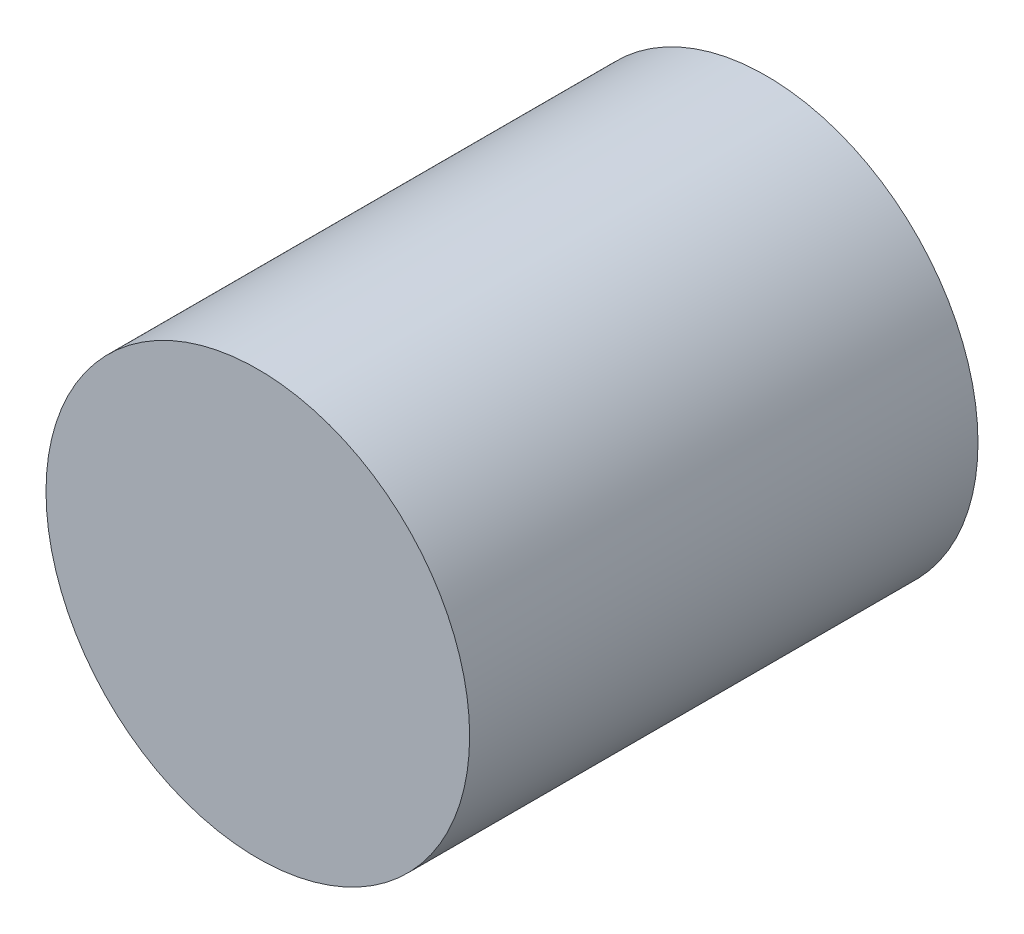
ISO-10303-21;
HEADER;
FILE_DESCRIPTION(('STEP AP214'),'2;1');
FILE_NAME('part.step','',(''),(''),'','','');
FILE_SCHEMA(('AUTOMOTIVE_DESIGN { 1 0 10303 214 1 1 1 1 }'));
ENDSEC;
DATA;
#1=APPLICATION_CONTEXT('core data for automotive mechanical design processes');
#2=APPLICATION_PROTOCOL_DEFINITION('international standard','automotive_design',2000,#1);
#3=PRODUCT_CONTEXT('',#1,'mechanical');
#4=PRODUCT('Part','Part','',(#3));
#5=PRODUCT_RELATED_PRODUCT_CATEGORY('part','',(#4));
#6=PRODUCT_DEFINITION_FORMATION('','',#4);
#7=PRODUCT_DEFINITION_CONTEXT('part definition',#1,'design');
#8=PRODUCT_DEFINITION('design','',#6,#7);
#9=PRODUCT_DEFINITION_SHAPE('','',#8);
#10=(LENGTH_UNIT() NAMED_UNIT(*) SI_UNIT(.MILLI.,.METRE.));
#11=(NAMED_UNIT(*) PLANE_ANGLE_UNIT() SI_UNIT($,.RADIAN.));
#12=(NAMED_UNIT(*) SI_UNIT($,.STERADIAN.) SOLID_ANGLE_UNIT());
#13=UNCERTAINTY_MEASURE_WITH_UNIT(LENGTH_MEASURE(1.E-05),#10,'distance_accuracy_value','');
#14=(GEOMETRIC_REPRESENTATION_CONTEXT(3) GLOBAL_UNCERTAINTY_ASSIGNED_CONTEXT((#13)) GLOBAL_UNIT_ASSIGNED_CONTEXT((#10,
#11,#12)) REPRESENTATION_CONTEXT('',''));
#15=CARTESIAN_POINT('',(0.,0.,0.));
#16=DIRECTION('',(0.,0.,1.));
#17=DIRECTION('',(1.,0.,0.));
#18=AXIS2_PLACEMENT_3D('',#15,#16,#17);
#19=CARTESIAN_POINT('',(0.,0.,0.));
#20=DIRECTION('',(0.,0.,1.));
#21=DIRECTION('',(1.,0.,0.));
#22=AXIS2_PLACEMENT_3D('',#19,#20,#21);
#23=PLANE('',#22);
#24=CARTESIAN_POINT('',(0.,0.,0.));
#25=DIRECTION('',(0.,0.,1.));
#26=DIRECTION('',(1.,0.,0.));
#27=AXIS2_PLACEMENT_3D('',#24,#25,#26);
#28=CIRCLE('',#27,5.);
#29=CARTESIAN_POINT('',(5.,0.,0.));
#30=VERTEX_POINT('',#29);
#31=EDGE_CURVE('E11',#30,#30,#28,.T.);
#32=ORIENTED_EDGE('',*,*,#31,.F.);
#33=EDGE_LOOP('',(#32));
#34=FACE_BOUND('',#33,.T.);
#35=ADVANCED_FACE('F40',(#34),#23,.F.);
#36=CARTESIAN_POINT('',(0.,0.,0.));
#37=DIRECTION('',(0.,0.,1.));
#38=DIRECTION('',(1.,0.,0.));
#39=AXIS2_PLACEMENT_3D('',#36,#37,#38);
#40=CYLINDRICAL_SURFACE('',#39,5.);
#41=ORIENTED_EDGE('',*,*,#31,.T.);
#42=EDGE_LOOP('',(#41));
#43=FACE_BOUND('',#42,.T.);
#44=CARTESIAN_POINT('',(0.,0.,12.));
#45=DIRECTION('',(0.,0.,1.));
#46=DIRECTION('',(1.,0.,0.));
#47=AXIS2_PLACEMENT_3D('',#44,#45,#46);
#48=CIRCLE('',#47,5.);
#49=CARTESIAN_POINT('',(5.,0.,12.));
#50=VERTEX_POINT('',#49);
#51=EDGE_CURVE('E43',#50,#50,#48,.T.);
#52=ORIENTED_EDGE('',*,*,#51,.F.);
#53=EDGE_LOOP('',(#52));
#54=FACE_BOUND('',#53,.T.);
#55=ADVANCED_FACE('F54',(#43,#54),#40,.T.);
#56=CARTESIAN_POINT('',(0.,0.,12.));
#57=DIRECTION('',(0.,0.,1.));
#58=DIRECTION('',(1.,0.,0.));
#59=AXIS2_PLACEMENT_3D('',#56,#57,#58);
#60=PLANE('',#59);
#61=ORIENTED_EDGE('',*,*,#51,.T.);
#62=EDGE_LOOP('',(#61));
#63=FACE_BOUND('',#62,.T.);
#64=ADVANCED_FACE('F52',(#63),#60,.T.);
#65=CLOSED_SHELL('',(#35,#55,#64));
#66=MANIFOLD_SOLID_BREP('B2',#65);
#67=ADVANCED_BREP_SHAPE_REPRESENTATION('',(#18,#66),#14);
#68=SHAPE_DEFINITION_REPRESENTATION(#9,#67);
ENDSEC;
END-ISO-10303-21;
